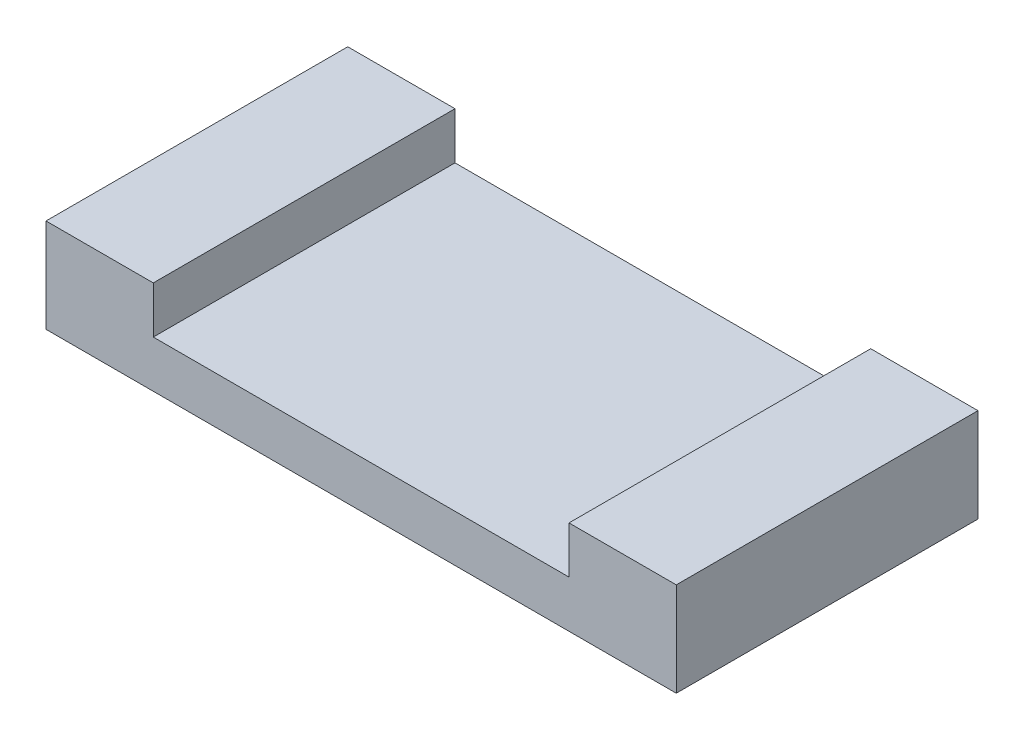
ISO-10303-21;
HEADER;
FILE_DESCRIPTION(('STEP AP214'),'2;1');
FILE_NAME('part.step','',(''),(''),'','','');
FILE_SCHEMA(('AUTOMOTIVE_DESIGN { 1 0 10303 214 1 1 1 1 }'));
ENDSEC;
DATA;
#1=APPLICATION_CONTEXT('core data for automotive mechanical design processes');
#2=APPLICATION_PROTOCOL_DEFINITION('international standard','automotive_design',2000,#1);
#3=PRODUCT_CONTEXT('',#1,'mechanical');
#4=PRODUCT('Part','Part','',(#3));
#5=PRODUCT_RELATED_PRODUCT_CATEGORY('part','',(#4));
#6=PRODUCT_DEFINITION_FORMATION('','',#4);
#7=PRODUCT_DEFINITION_CONTEXT('part definition',#1,'design');
#8=PRODUCT_DEFINITION('design','',#6,#7);
#9=PRODUCT_DEFINITION_SHAPE('','',#8);
#10=(LENGTH_UNIT() NAMED_UNIT(*) SI_UNIT(.MILLI.,.METRE.));
#11=(NAMED_UNIT(*) PLANE_ANGLE_UNIT() SI_UNIT($,.RADIAN.));
#12=(NAMED_UNIT(*) SI_UNIT($,.STERADIAN.) SOLID_ANGLE_UNIT());
#13=UNCERTAINTY_MEASURE_WITH_UNIT(LENGTH_MEASURE(1.E-05),#10,'distance_accuracy_value','');
#14=(GEOMETRIC_REPRESENTATION_CONTEXT(3) GLOBAL_UNCERTAINTY_ASSIGNED_CONTEXT((#13)) GLOBAL_UNIT_ASSIGNED_CONTEXT((#10,
#11,#12)) REPRESENTATION_CONTEXT('',''));
#15=CARTESIAN_POINT('',(0.,0.,0.));
#16=DIRECTION('',(0.,0.,1.));
#17=DIRECTION('',(1.,0.,0.));
#18=AXIS2_PLACEMENT_3D('',#15,#16,#17);
#19=CARTESIAN_POINT('',(-23.5,-2.,-11.25));
#20=DIRECTION('',(-1.,0.,0.));
#21=DIRECTION('',(0.,0.,1.));
#22=AXIS2_PLACEMENT_3D('',#19,#20,#21);
#23=PLANE('',#22);
#24=DIRECTION('',(0.,1.,0.));
#25=VECTOR('',#24,1.);
#26=CARTESIAN_POINT('',(-23.5,-2.,11.25));
#27=LINE('',#26,#25);
#28=CARTESIAN_POINT('',(-23.5,-2.,11.25));
#29=VERTEX_POINT('',#28);
#30=CARTESIAN_POINT('',(-23.5,5.,11.25));
#31=VERTEX_POINT('',#30);
#32=EDGE_CURVE('E36',#29,#31,#27,.T.);
#33=ORIENTED_EDGE('',*,*,#32,.T.);
#34=DIRECTION('',(0.,0.,1.));
#35=VECTOR('',#34,1.);
#36=CARTESIAN_POINT('',(-23.5,5.,-58.5152091923859));
#37=LINE('',#36,#35);
#38=CARTESIAN_POINT('',(-23.5,5.,-11.25));
#39=VERTEX_POINT('',#38);
#40=EDGE_CURVE('E96',#39,#31,#37,.T.);
#41=ORIENTED_EDGE('',*,*,#40,.F.);
#42=DIRECTION('',(0.,1.,0.));
#43=VECTOR('',#42,1.);
#44=CARTESIAN_POINT('',(-23.5,-2.,-11.25));
#45=LINE('',#44,#43);
#46=CARTESIAN_POINT('',(-23.5,-2.,-11.25));
#47=VERTEX_POINT('',#46);
#48=EDGE_CURVE('E11',#47,#39,#45,.T.);
#49=ORIENTED_EDGE('',*,*,#48,.F.);
#50=DIRECTION('',(0.,0.,1.));
#51=VECTOR('',#50,1.);
#52=CARTESIAN_POINT('',(-23.5,-2.,-11.25));
#53=LINE('',#52,#51);
#54=EDGE_CURVE('E98',#47,#29,#53,.T.);
#55=ORIENTED_EDGE('',*,*,#54,.T.);
#56=EDGE_LOOP('',(#33,#41,#49,#55));
#57=FACE_BOUND('',#56,.T.);
#58=ADVANCED_FACE('F33',(#57),#23,.T.);
#59=CARTESIAN_POINT('',(23.5,-2.,-11.25));
#60=DIRECTION('',(0.,0.,-1.));
#61=DIRECTION('',(-1.,0.,0.));
#62=AXIS2_PLACEMENT_3D('',#59,#60,#61);
#63=PLANE('',#62);
#64=ORIENTED_EDGE('',*,*,#48,.T.);
#65=DIRECTION('',(-1.,0.,0.));
#66=VECTOR('',#65,1.);
#67=CARTESIAN_POINT('',(-23.5,5.,-11.25));
#68=LINE('',#67,#66);
#69=CARTESIAN_POINT('',(-15.5,5.,-11.25));
#70=VERTEX_POINT('',#69);
#71=EDGE_CURVE('E110',#70,#39,#68,.T.);
#72=ORIENTED_EDGE('',*,*,#71,.F.);
#73=DIRECTION('',(0.,1.,0.));
#74=VECTOR('',#73,1.);
#75=CARTESIAN_POINT('',(-15.5,5.,-11.25));
#76=LINE('',#75,#74);
#77=CARTESIAN_POINT('',(-15.5,1.50174100310097,-11.25));
#78=VERTEX_POINT('',#77);
#79=EDGE_CURVE('E134',#78,#70,#76,.T.);
#80=ORIENTED_EDGE('',*,*,#79,.F.);
#81=DIRECTION('',(-1.,0.,0.));
#82=VECTOR('',#81,1.);
#83=CARTESIAN_POINT('',(-15.5,1.50174100310097,-11.25));
#84=LINE('',#83,#82);
#85=CARTESIAN_POINT('',(15.5,1.50174100310097,-11.25));
#86=VERTEX_POINT('',#85);
#87=EDGE_CURVE('E138',#86,#78,#84,.T.);
#88=ORIENTED_EDGE('',*,*,#87,.F.);
#89=DIRECTION('',(0.,-1.,0.));
#90=VECTOR('',#89,1.);
#91=CARTESIAN_POINT('',(15.5,1.50174100310097,-11.25));
#92=LINE('',#91,#90);
#93=CARTESIAN_POINT('',(15.5,5.,-11.25));
#94=VERTEX_POINT('',#93);
#95=EDGE_CURVE('E142',#94,#86,#92,.T.);
#96=ORIENTED_EDGE('',*,*,#95,.F.);
#97=DIRECTION('',(-1.,0.,0.));
#98=VECTOR('',#97,1.);
#99=CARTESIAN_POINT('',(15.5,5.,-11.25));
#100=LINE('',#99,#98);
#101=CARTESIAN_POINT('',(23.5,5.,-11.25));
#102=VERTEX_POINT('',#101);
#103=EDGE_CURVE('E120',#102,#94,#100,.T.);
#104=ORIENTED_EDGE('',*,*,#103,.F.);
#105=DIRECTION('',(0.,1.,0.));
#106=VECTOR('',#105,1.);
#107=CARTESIAN_POINT('',(23.5,-2.,-11.25));
#108=LINE('',#107,#106);
#109=CARTESIAN_POINT('',(23.5,-2.,-11.25));
#110=VERTEX_POINT('',#109);
#111=EDGE_CURVE('E41',#110,#102,#108,.T.);
#112=ORIENTED_EDGE('',*,*,#111,.F.);
#113=DIRECTION('',(-1.,0.,0.));
#114=VECTOR('',#113,1.);
#115=CARTESIAN_POINT('',(23.5,-2.,-11.25));
#116=LINE('',#115,#114);
#117=EDGE_CURVE('E104',#110,#47,#116,.T.);
#118=ORIENTED_EDGE('',*,*,#117,.T.);
#119=EDGE_LOOP('',(#64,#72,#80,#88,#96,#104,#112,#118));
#120=FACE_BOUND('',#119,.T.);
#121=ADVANCED_FACE('F176',(#120),#63,.T.);
#122=CARTESIAN_POINT('',(23.5,-2.,-11.25));
#123=DIRECTION('',(1.,0.,0.));
#124=DIRECTION('',(0.,0.,-1.));
#125=AXIS2_PLACEMENT_3D('',#122,#123,#124);
#126=PLANE('',#125);
#127=ORIENTED_EDGE('',*,*,#111,.T.);
#128=DIRECTION('',(0.,0.,1.));
#129=VECTOR('',#128,1.);
#130=CARTESIAN_POINT('',(23.5,5.,-58.5152091923859));
#131=LINE('',#130,#129);
#132=CARTESIAN_POINT('',(23.5,5.,11.25));
#133=VERTEX_POINT('',#132);
#134=EDGE_CURVE('E117',#102,#133,#131,.T.);
#135=ORIENTED_EDGE('',*,*,#134,.T.);
#136=DIRECTION('',(0.,1.,0.));
#137=VECTOR('',#136,1.);
#138=CARTESIAN_POINT('',(23.5,-2.,11.25));
#139=LINE('',#138,#137);
#140=CARTESIAN_POINT('',(23.5,-2.,11.25));
#141=VERTEX_POINT('',#140);
#142=EDGE_CURVE('E103',#141,#133,#139,.T.);
#143=ORIENTED_EDGE('',*,*,#142,.F.);
#144=DIRECTION('',(0.,0.,-1.));
#145=VECTOR('',#144,1.);
#146=CARTESIAN_POINT('',(23.5,-2.,-11.25));
#147=LINE('',#146,#145);
#148=EDGE_CURVE('E155',#141,#110,#147,.T.);
#149=ORIENTED_EDGE('',*,*,#148,.T.);
#150=EDGE_LOOP('',(#127,#135,#143,#149));
#151=FACE_BOUND('',#150,.T.);
#152=ADVANCED_FACE('F162',(#151),#126,.T.);
#153=CARTESIAN_POINT('',(23.5,-2.,11.25));
#154=DIRECTION('',(0.,0.,1.));
#155=DIRECTION('',(1.,0.,0.));
#156=AXIS2_PLACEMENT_3D('',#153,#154,#155);
#157=PLANE('',#156);
#158=ORIENTED_EDGE('',*,*,#142,.T.);
#159=DIRECTION('',(-1.,0.,0.));
#160=VECTOR('',#159,1.);
#161=CARTESIAN_POINT('',(15.5,5.,11.25));
#162=LINE('',#161,#160);
#163=CARTESIAN_POINT('',(15.5,5.,11.25));
#164=VERTEX_POINT('',#163);
#165=EDGE_CURVE('E129',#133,#164,#162,.T.);
#166=ORIENTED_EDGE('',*,*,#165,.T.);
#167=DIRECTION('',(0.,-1.,0.));
#168=VECTOR('',#167,1.);
#169=CARTESIAN_POINT('',(15.5,1.50174100310097,11.25));
#170=LINE('',#169,#168);
#171=CARTESIAN_POINT('',(15.5,1.50174100310097,11.25));
#172=VERTEX_POINT('',#171);
#173=EDGE_CURVE('E126',#164,#172,#170,.T.);
#174=ORIENTED_EDGE('',*,*,#173,.T.);
#175=DIRECTION('',(-1.,0.,0.));
#176=VECTOR('',#175,1.);
#177=CARTESIAN_POINT('',(-15.5,1.50174100310097,11.25));
#178=LINE('',#177,#176);
#179=CARTESIAN_POINT('',(-15.5,1.50174100310097,11.25));
#180=VERTEX_POINT('',#179);
#181=EDGE_CURVE('E122',#172,#180,#178,.T.);
#182=ORIENTED_EDGE('',*,*,#181,.T.);
#183=DIRECTION('',(0.,1.,0.));
#184=VECTOR('',#183,1.);
#185=CARTESIAN_POINT('',(-15.5,5.,11.25));
#186=LINE('',#185,#184);
#187=CARTESIAN_POINT('',(-15.5,5.,11.25));
#188=VERTEX_POINT('',#187);
#189=EDGE_CURVE('E116',#180,#188,#186,.T.);
#190=ORIENTED_EDGE('',*,*,#189,.T.);
#191=DIRECTION('',(-1.,0.,0.));
#192=VECTOR('',#191,1.);
#193=CARTESIAN_POINT('',(-23.5,5.,11.25));
#194=LINE('',#193,#192);
#195=EDGE_CURVE('E109',#188,#31,#194,.T.);
#196=ORIENTED_EDGE('',*,*,#195,.T.);
#197=ORIENTED_EDGE('',*,*,#32,.F.);
#198=DIRECTION('',(1.,0.,0.));
#199=VECTOR('',#198,1.);
#200=CARTESIAN_POINT('',(23.5,-2.,11.25));
#201=LINE('',#200,#199);
#202=EDGE_CURVE('E153',#29,#141,#201,.T.);
#203=ORIENTED_EDGE('',*,*,#202,.T.);
#204=EDGE_LOOP('',(#158,#166,#174,#182,#190,#196,#197,#203));
#205=FACE_BOUND('',#204,.T.);
#206=ADVANCED_FACE('F113',(#205),#157,.T.);
#207=CARTESIAN_POINT('',(0.,-2.,0.));
#208=DIRECTION('',(0.,-1.,0.));
#209=DIRECTION('',(0.,0.,-1.));
#210=AXIS2_PLACEMENT_3D('',#207,#208,#209);
#211=PLANE('',#210);
#212=ORIENTED_EDGE('',*,*,#54,.F.);
#213=ORIENTED_EDGE('',*,*,#117,.F.);
#214=ORIENTED_EDGE('',*,*,#148,.F.);
#215=ORIENTED_EDGE('',*,*,#202,.F.);
#216=EDGE_LOOP('',(#212,#213,#214,#215));
#217=FACE_BOUND('',#216,.T.);
#218=ADVANCED_FACE('F179',(#217),#211,.T.);
#219=CARTESIAN_POINT('',(15.5,5.,-58.5152091923859));
#220=DIRECTION('',(0.,1.,0.));
#221=DIRECTION('',(-1.,0.,0.));
#222=AXIS2_PLACEMENT_3D('',#219,#220,#221);
#223=PLANE('',#222);
#224=ORIENTED_EDGE('',*,*,#134,.F.);
#225=ORIENTED_EDGE('',*,*,#103,.T.);
#226=DIRECTION('',(0.,0.,1.));
#227=VECTOR('',#226,1.);
#228=CARTESIAN_POINT('',(15.5,5.,-58.5152091923859));
#229=LINE('',#228,#227);
#230=EDGE_CURVE('E145',#94,#164,#229,.T.);
#231=ORIENTED_EDGE('',*,*,#230,.T.);
#232=ORIENTED_EDGE('',*,*,#165,.F.);
#233=EDGE_LOOP('',(#224,#225,#231,#232));
#234=FACE_BOUND('',#233,.T.);
#235=ADVANCED_FACE('F164',(#234),#223,.T.);
#236=CARTESIAN_POINT('',(15.5,1.50174100310097,-58.5152091923859));
#237=DIRECTION('',(-1.,0.,0.));
#238=DIRECTION('',(0.,-1.,0.));
#239=AXIS2_PLACEMENT_3D('',#236,#237,#238);
#240=PLANE('',#239);
#241=ORIENTED_EDGE('',*,*,#230,.F.);
#242=ORIENTED_EDGE('',*,*,#95,.T.);
#243=DIRECTION('',(0.,0.,1.));
#244=VECTOR('',#243,1.);
#245=CARTESIAN_POINT('',(15.5,1.50174100310097,-58.5152091923859));
#246=LINE('',#245,#244);
#247=EDGE_CURVE('E141',#86,#172,#246,.T.);
#248=ORIENTED_EDGE('',*,*,#247,.T.);
#249=ORIENTED_EDGE('',*,*,#173,.F.);
#250=EDGE_LOOP('',(#241,#242,#248,#249));
#251=FACE_BOUND('',#250,.T.);
#252=ADVANCED_FACE('F168',(#251),#240,.T.);
#253=CARTESIAN_POINT('',(-15.5,1.50174100310097,-58.5152091923859));
#254=DIRECTION('',(0.,1.,0.));
#255=DIRECTION('',(0.,0.,1.));
#256=AXIS2_PLACEMENT_3D('',#253,#254,#255);
#257=PLANE('',#256);
#258=ORIENTED_EDGE('',*,*,#247,.F.);
#259=ORIENTED_EDGE('',*,*,#87,.T.);
#260=DIRECTION('',(0.,0.,1.));
#261=VECTOR('',#260,1.);
#262=CARTESIAN_POINT('',(-15.5,1.50174100310097,-58.5152091923859));
#263=LINE('',#262,#261);
#264=EDGE_CURVE('E137',#78,#180,#263,.T.);
#265=ORIENTED_EDGE('',*,*,#264,.T.);
#266=ORIENTED_EDGE('',*,*,#181,.F.);
#267=EDGE_LOOP('',(#258,#259,#265,#266));
#268=FACE_BOUND('',#267,.T.);
#269=ADVANCED_FACE('F172',(#268),#257,.T.);
#270=CARTESIAN_POINT('',(-15.5,5.,-58.5152091923859));
#271=DIRECTION('',(1.,0.,0.));
#272=DIRECTION('',(0.,1.,0.));
#273=AXIS2_PLACEMENT_3D('',#270,#271,#272);
#274=PLANE('',#273);
#275=ORIENTED_EDGE('',*,*,#264,.F.);
#276=ORIENTED_EDGE('',*,*,#79,.T.);
#277=DIRECTION('',(0.,0.,1.));
#278=VECTOR('',#277,1.);
#279=CARTESIAN_POINT('',(-15.5,5.,-58.5152091923859));
#280=LINE('',#279,#278);
#281=EDGE_CURVE('E133',#70,#188,#280,.T.);
#282=ORIENTED_EDGE('',*,*,#281,.T.);
#283=ORIENTED_EDGE('',*,*,#189,.F.);
#284=EDGE_LOOP('',(#275,#276,#282,#283));
#285=FACE_BOUND('',#284,.T.);
#286=ADVANCED_FACE('F175',(#285),#274,.T.);
#287=CARTESIAN_POINT('',(-23.5,5.,-58.5152091923859));
#288=DIRECTION('',(0.,1.,0.));
#289=DIRECTION('',(-1.,0.,0.));
#290=AXIS2_PLACEMENT_3D('',#287,#288,#289);
#291=PLANE('',#290);
#292=ORIENTED_EDGE('',*,*,#281,.F.);
#293=ORIENTED_EDGE('',*,*,#71,.T.);
#294=ORIENTED_EDGE('',*,*,#40,.T.);
#295=ORIENTED_EDGE('',*,*,#195,.F.);
#296=EDGE_LOOP('',(#292,#293,#294,#295));
#297=FACE_BOUND('',#296,.T.);
#298=ADVANCED_FACE('F108',(#297),#291,.T.);
#299=CLOSED_SHELL('',(#58,#121,#152,#206,#218,#235,#252,#269,#286,#298));
#300=MANIFOLD_SOLID_BREP('B2',#299);
#301=ADVANCED_BREP_SHAPE_REPRESENTATION('',(#18,#300),#14);
#302=SHAPE_DEFINITION_REPRESENTATION(#9,#301);
ENDSEC;
END-ISO-10303-21;
